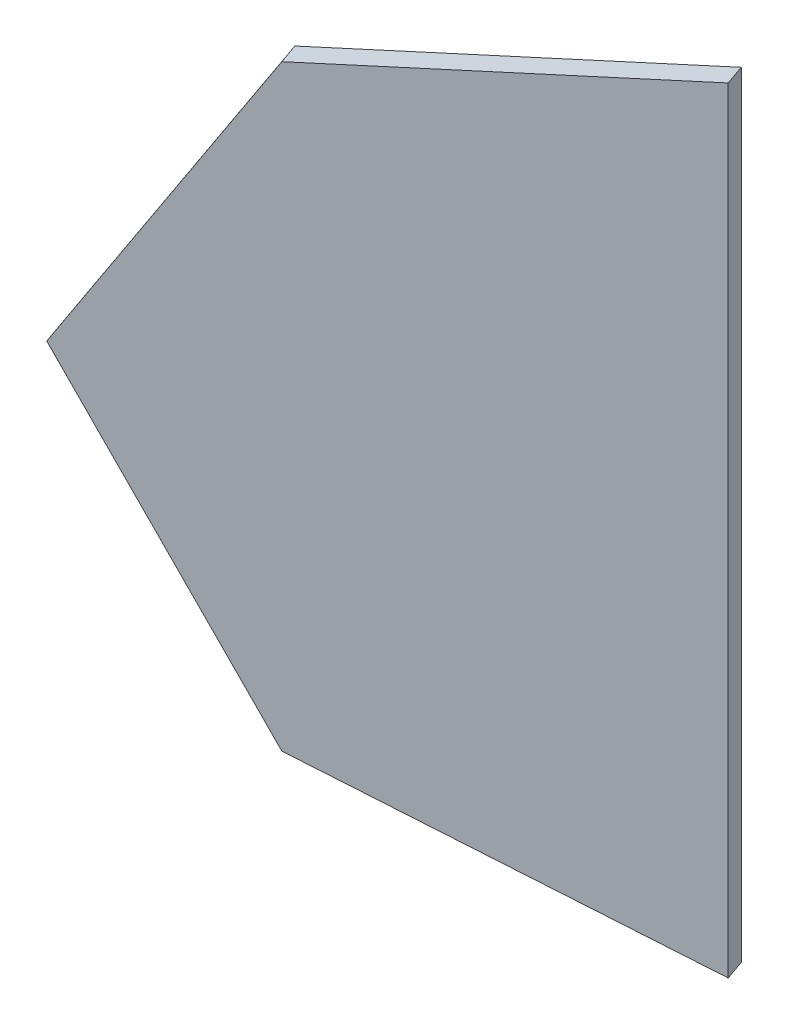
ISO-10303-21;
HEADER;
FILE_DESCRIPTION(('STEP AP214'),'2;1');
FILE_NAME('part.step','',(''),(''),'','','');
FILE_SCHEMA(('AUTOMOTIVE_DESIGN { 1 0 10303 214 1 1 1 1 }'));
ENDSEC;
DATA;
#1=APPLICATION_CONTEXT('core data for automotive mechanical design processes');
#2=APPLICATION_PROTOCOL_DEFINITION('international standard','automotive_design',2000,#1);
#3=PRODUCT_CONTEXT('',#1,'mechanical');
#4=PRODUCT('Part','Part','',(#3));
#5=PRODUCT_RELATED_PRODUCT_CATEGORY('part','',(#4));
#6=PRODUCT_DEFINITION_FORMATION('','',#4);
#7=PRODUCT_DEFINITION_CONTEXT('part definition',#1,'design');
#8=PRODUCT_DEFINITION('design','',#6,#7);
#9=PRODUCT_DEFINITION_SHAPE('','',#8);
#10=(LENGTH_UNIT() NAMED_UNIT(*) SI_UNIT(.MILLI.,.METRE.));
#11=(NAMED_UNIT(*) PLANE_ANGLE_UNIT() SI_UNIT($,.RADIAN.));
#12=(NAMED_UNIT(*) SI_UNIT($,.STERADIAN.) SOLID_ANGLE_UNIT());
#13=UNCERTAINTY_MEASURE_WITH_UNIT(LENGTH_MEASURE(1.E-05),#10,'distance_accuracy_value','');
#14=(GEOMETRIC_REPRESENTATION_CONTEXT(3) GLOBAL_UNCERTAINTY_ASSIGNED_CONTEXT((#13)) GLOBAL_UNIT_ASSIGNED_CONTEXT((#10,
#11,#12)) REPRESENTATION_CONTEXT('',''));
#15=CARTESIAN_POINT('',(0.,0.,0.));
#16=DIRECTION('',(0.,0.,1.));
#17=DIRECTION('',(1.,0.,0.));
#18=AXIS2_PLACEMENT_3D('',#15,#16,#17);
#19=CARTESIAN_POINT('',(-461.485496972846,245.721207525586,-114.997546327707));
#20=DIRECTION('',(-0.802895095526454,0.525729017758259,0.281013283434259));
#21=DIRECTION('',(-0.547803368830946,-0.836607117527377,0.));
#22=AXIS2_PLACEMENT_3D('',#19,#20,#21);
#23=PLANE('',#22);
#24=DIRECTION('',(0.496213726595231,0.850652102734683,-0.173674804308331));
#25=VECTOR('',#24,1.);
#26=CARTESIAN_POINT('',(-463.176263481647,245.721207525586,-119.828307781424));
#27=LINE('',#26,#25);
#28=CARTESIAN_POINT('',(-654.721107961543,-82.6413830113789,-52.7876122134601));
#29=VERTEX_POINT('',#28);
#30=CARTESIAN_POINT('',(-612.867433263476,-10.8922263861224,-67.4363983577833));
#31=VERTEX_POINT('',#30);
#32=EDGE_CURVE('E112',#29,#31,#27,.T.);
#33=ORIENTED_EDGE('',*,*,#32,.F.);
#34=DIRECTION('',(-0.330350424728106,0.,-0.943858356366017));
#35=VECTOR('',#34,1.);
#36=CARTESIAN_POINT('',(-653.030341452742,-82.6413830113789,-47.9568507597432));
#37=LINE('',#36,#35);
#38=CARTESIAN_POINT('',(-653.030341452742,-82.6413830113789,-47.9568507597432));
#39=VERTEX_POINT('',#38);
#40=EDGE_CURVE('E11',#39,#29,#37,.T.);
#41=ORIENTED_EDGE('',*,*,#40,.F.);
#42=DIRECTION('',(0.496213726595231,0.850652102734683,-0.173674804308331));
#43=VECTOR('',#42,1.);
#44=CARTESIAN_POINT('',(-461.485496972846,245.721207525586,-114.997546327707));
#45=LINE('',#44,#43);
#46=CARTESIAN_POINT('',(-611.176666754675,-10.8922263861224,-62.6056369040664));
#47=VERTEX_POINT('',#46);
#48=EDGE_CURVE('E107',#39,#47,#45,.T.);
#49=ORIENTED_EDGE('',*,*,#48,.T.);
#50=DIRECTION('',(-0.330350424728106,0.,-0.943858356366017));
#51=VECTOR('',#50,1.);
#52=CARTESIAN_POINT('',(-611.176666754675,-10.8922263861224,-62.6056369040664));
#53=LINE('',#52,#51);
#54=EDGE_CURVE('E38',#47,#31,#53,.T.);
#55=ORIENTED_EDGE('',*,*,#54,.T.);
#56=EDGE_LOOP('',(#33,#41,#49,#55));
#57=FACE_BOUND('',#56,.T.);
#58=ADVANCED_FACE('F35',(#57),#23,.T.);
#59=CARTESIAN_POINT('',(-531.252220234673,-291.403876528069,-90.5791931860674));
#60=DIRECTION('',(-0.802895095526454,-0.525729017758258,0.281013283434259));
#61=DIRECTION('',(0.547803368830946,-0.836607117527377,0.));
#62=AXIS2_PLACEMENT_3D('',#59,#60,#61);
#63=PLANE('',#62);
#64=DIRECTION('',(-0.49621372659523,0.850652102734683,0.173674804308331));
#65=VECTOR('',#64,1.);
#66=CARTESIAN_POINT('',(-532.942986743474,-291.403876528069,-95.4099546397843));
#67=LINE('',#66,#65);
#68=CARTESIAN_POINT('',(-612.867433263476,-154.390539636636,-67.4363983577834));
#69=VERTEX_POINT('',#68);
#70=EDGE_CURVE('E121',#69,#29,#67,.T.);
#71=ORIENTED_EDGE('',*,*,#70,.F.);
#72=DIRECTION('',(-0.330350424728106,0.,-0.943858356366017));
#73=VECTOR('',#72,1.);
#74=CARTESIAN_POINT('',(-611.176666754675,-154.390539636636,-62.6056369040665));
#75=LINE('',#74,#73);
#76=CARTESIAN_POINT('',(-611.176666754675,-154.390539636636,-62.6056369040665));
#77=VERTEX_POINT('',#76);
#78=EDGE_CURVE('E44',#77,#69,#75,.T.);
#79=ORIENTED_EDGE('',*,*,#78,.F.);
#80=DIRECTION('',(-0.49621372659523,0.850652102734683,0.173674804308331));
#81=VECTOR('',#80,1.);
#82=CARTESIAN_POINT('',(-531.252220234673,-291.403876528069,-90.5791931860674));
#83=LINE('',#82,#81);
#84=EDGE_CURVE('E102',#77,#39,#83,.T.);
#85=ORIENTED_EDGE('',*,*,#84,.T.);
#86=ORIENTED_EDGE('',*,*,#40,.T.);
#87=EDGE_LOOP('',(#71,#79,#85,#86));
#88=FACE_BOUND('',#87,.T.);
#89=ADVANCED_FACE('F127',(#88),#63,.T.);
#90=CARTESIAN_POINT('',(-152.846298449269,-277.787177257323,-223.021265810959));
#91=DIRECTION('',(-0.232461080785185,-0.969196663245085,0.0813613782748147));
#92=DIRECTION('',(0.972420560882724,-0.233234330175744,0.));
#93=AXIS2_PLACEMENT_3D('',#90,#91,#92);
#94=PLANE('',#93);
#95=DIRECTION('',(-0.914784369565934,0.246288099498522,0.320174529348077));
#96=VECTOR('',#95,1.);
#97=CARTESIAN_POINT('',(-154.53706495807,-277.787177257323,-227.852027264676));
#98=LINE('',#97,#96);
#99=CARTESIAN_POINT('',(-533.4,-175.785617822957,-95.25));
#100=VERTEX_POINT('',#99);
#101=EDGE_CURVE('E91',#100,#69,#98,.T.);
#102=ORIENTED_EDGE('',*,*,#101,.F.);
#103=DIRECTION('',(-0.330350424728106,0.,-0.943858356366017));
#104=VECTOR('',#103,1.);
#105=CARTESIAN_POINT('',(-531.709233491199,-175.785617822957,-90.4192385462831));
#106=LINE('',#105,#104);
#107=CARTESIAN_POINT('',(-531.709233491199,-175.785617822957,-90.4192385462831));
#108=VERTEX_POINT('',#107);
#109=EDGE_CURVE('E86',#108,#100,#106,.T.);
#110=ORIENTED_EDGE('',*,*,#109,.F.);
#111=DIRECTION('',(-0.914784369565934,0.246288099498522,0.320174529348077));
#112=VECTOR('',#111,1.);
#113=CARTESIAN_POINT('',(-152.846298449269,-277.787177257323,-223.021265810959));
#114=LINE('',#113,#112);
#115=EDGE_CURVE('E89',#108,#77,#114,.T.);
#116=ORIENTED_EDGE('',*,*,#115,.T.);
#117=ORIENTED_EDGE('',*,*,#78,.T.);
#118=EDGE_LOOP('',(#102,#110,#116,#117));
#119=FACE_BOUND('',#118,.T.);
#120=ADVANCED_FACE('F88',(#119),#94,.T.);
#121=CARTESIAN_POINT('',(-531.709233491199,0.,-90.4192385462831));
#122=DIRECTION('',(0.943858356366017,0.,-0.330350424728106));
#123=DIRECTION('',(-0.330350424728106,0.,-0.943858356366018));
#124=AXIS2_PLACEMENT_3D('',#121,#122,#123);
#125=PLANE('',#124);
#126=DIRECTION('',(0.,-1.,0.));
#127=VECTOR('',#126,1.);
#128=CARTESIAN_POINT('',(-533.4,0.,-95.25));
#129=LINE('',#128,#127);
#130=CARTESIAN_POINT('',(-533.4,10.5028518001982,-95.25));
#131=VERTEX_POINT('',#130);
#132=EDGE_CURVE('E118',#131,#100,#129,.T.);
#133=ORIENTED_EDGE('',*,*,#132,.F.);
#134=DIRECTION('',(-0.330350424728106,0.,-0.943858356366017));
#135=VECTOR('',#134,1.);
#136=CARTESIAN_POINT('',(-531.709233491199,10.5028518001982,-90.4192385462831));
#137=LINE('',#136,#135);
#138=CARTESIAN_POINT('',(-531.709233491199,10.5028518001982,-90.4192385462831));
#139=VERTEX_POINT('',#138);
#140=EDGE_CURVE('E96',#139,#131,#137,.T.);
#141=ORIENTED_EDGE('',*,*,#140,.F.);
#142=DIRECTION('',(0.,-1.,0.));
#143=VECTOR('',#142,1.);
#144=CARTESIAN_POINT('',(-531.709233491199,0.,-90.4192385462831));
#145=LINE('',#144,#143);
#146=EDGE_CURVE('E101',#139,#108,#145,.T.);
#147=ORIENTED_EDGE('',*,*,#146,.T.);
#148=ORIENTED_EDGE('',*,*,#109,.T.);
#149=EDGE_LOOP('',(#133,#141,#147,#148));
#150=FACE_BOUND('',#149,.T.);
#151=ADVANCED_FACE('F104',(#150),#125,.T.);
#152=CARTESIAN_POINT('',(-115.608007989703,122.530104819832,-236.054667471807));
#153=DIRECTION('',(-0.232461080785184,0.969196663245085,0.0813613782748146));
#154=DIRECTION('',(-0.972420560882724,-0.233234330175744,0.));
#155=AXIS2_PLACEMENT_3D('',#152,#153,#154);
#156=PLANE('',#155);
#157=DIRECTION('',(0.914784369565934,0.246288099498521,-0.320174529348077));
#158=VECTOR('',#157,1.);
#159=CARTESIAN_POINT('',(-117.298774498504,122.530104819832,-240.885428925524));
#160=LINE('',#159,#158);
#161=EDGE_CURVE('E115',#31,#131,#160,.T.);
#162=ORIENTED_EDGE('',*,*,#161,.F.);
#163=ORIENTED_EDGE('',*,*,#54,.F.);
#164=DIRECTION('',(0.914784369565934,0.246288099498521,-0.320174529348077));
#165=VECTOR('',#164,1.);
#166=CARTESIAN_POINT('',(-115.608007989703,122.530104819832,-236.054667471807));
#167=LINE('',#166,#165);
#168=EDGE_CURVE('E105',#47,#139,#167,.T.);
#169=ORIENTED_EDGE('',*,*,#168,.T.);
#170=ORIENTED_EDGE('',*,*,#140,.T.);
#171=EDGE_LOOP('',(#162,#163,#169,#170));
#172=FACE_BOUND('',#171,.T.);
#173=ADVANCED_FACE('F124',(#172),#156,.T.);
#174=CARTESIAN_POINT('',(-86.2192557629141,0.,-246.340730751183));
#175=DIRECTION('',(-0.330350424728106,0.,-0.943858356366017));
#176=DIRECTION('',(-0.943858356366017,0.,0.330350424728106));
#177=AXIS2_PLACEMENT_3D('',#174,#175,#176);
#178=PLANE('',#177);
#179=ORIENTED_EDGE('',*,*,#48,.F.);
#180=ORIENTED_EDGE('',*,*,#84,.F.);
#181=ORIENTED_EDGE('',*,*,#115,.F.);
#182=ORIENTED_EDGE('',*,*,#146,.F.);
#183=ORIENTED_EDGE('',*,*,#168,.F.);
#184=EDGE_LOOP('',(#179,#180,#181,#182,#183));
#185=FACE_BOUND('',#184,.T.);
#186=ADVANCED_FACE('F100',(#185),#178,.F.);
#187=CARTESIAN_POINT('',(-87.910022271715,0.,-251.1714922049));
#188=DIRECTION('',(-0.330350424728106,0.,-0.943858356366017));
#189=DIRECTION('',(-0.943858356366017,0.,0.330350424728106));
#190=AXIS2_PLACEMENT_3D('',#187,#188,#189);
#191=PLANE('',#190);
#192=ORIENTED_EDGE('',*,*,#32,.T.);
#193=ORIENTED_EDGE('',*,*,#161,.T.);
#194=ORIENTED_EDGE('',*,*,#132,.T.);
#195=ORIENTED_EDGE('',*,*,#101,.T.);
#196=ORIENTED_EDGE('',*,*,#70,.T.);
#197=EDGE_LOOP('',(#192,#193,#194,#195,#196));
#198=FACE_BOUND('',#197,.T.);
#199=ADVANCED_FACE('F126',(#198),#191,.T.);
#200=CLOSED_SHELL('',(#58,#89,#120,#151,#173,#186,#199));
#201=MANIFOLD_SOLID_BREP('B2',#200);
#202=ADVANCED_BREP_SHAPE_REPRESENTATION('',(#18,#201),#14);
#203=SHAPE_DEFINITION_REPRESENTATION(#9,#202);
ENDSEC;
END-ISO-10303-21;
